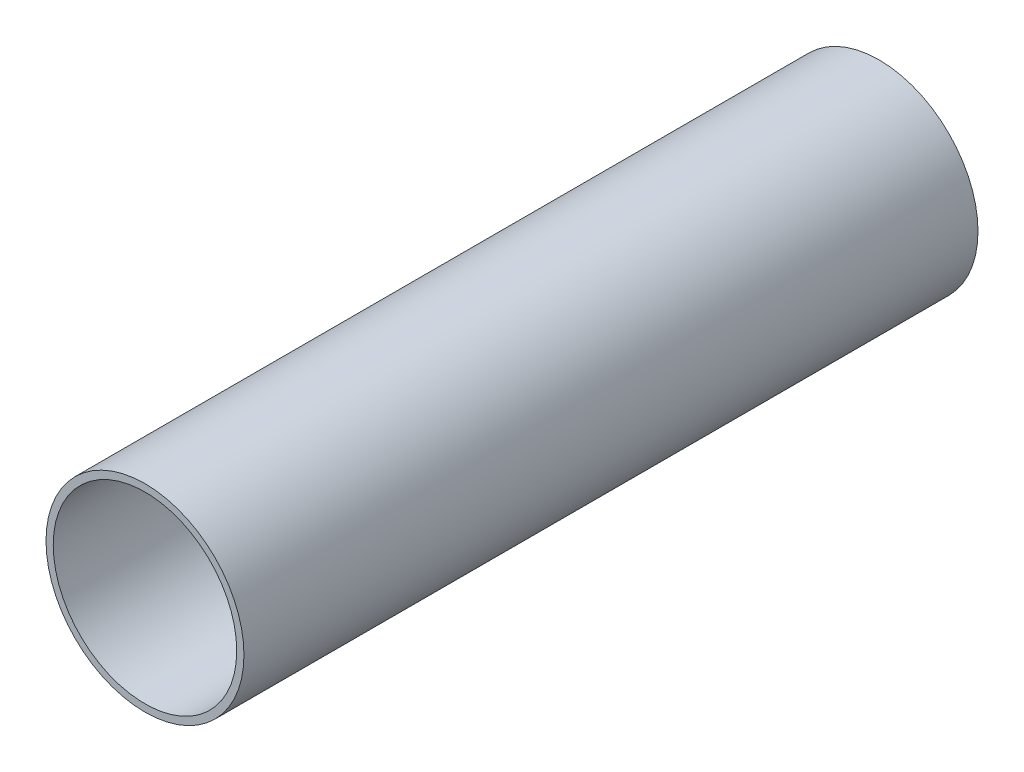
ISO-10303-21;
HEADER;
FILE_DESCRIPTION(('STEP AP214'),'2;1');
FILE_NAME('part.step','',(''),(''),'','','');
FILE_SCHEMA(('AUTOMOTIVE_DESIGN { 1 0 10303 214 1 1 1 1 }'));
ENDSEC;
DATA;
#1=APPLICATION_CONTEXT('core data for automotive mechanical design processes');
#2=APPLICATION_PROTOCOL_DEFINITION('international standard','automotive_design',2000,#1);
#3=PRODUCT_CONTEXT('',#1,'mechanical');
#4=PRODUCT('Part','Part','',(#3));
#5=PRODUCT_RELATED_PRODUCT_CATEGORY('part','',(#4));
#6=PRODUCT_DEFINITION_FORMATION('','',#4);
#7=PRODUCT_DEFINITION_CONTEXT('part definition',#1,'design');
#8=PRODUCT_DEFINITION('design','',#6,#7);
#9=PRODUCT_DEFINITION_SHAPE('','',#8);
#10=(LENGTH_UNIT() NAMED_UNIT(*) SI_UNIT(.MILLI.,.METRE.));
#11=(NAMED_UNIT(*) PLANE_ANGLE_UNIT() SI_UNIT($,.RADIAN.));
#12=(NAMED_UNIT(*) SI_UNIT($,.STERADIAN.) SOLID_ANGLE_UNIT());
#13=UNCERTAINTY_MEASURE_WITH_UNIT(LENGTH_MEASURE(1.E-05),#10,'distance_accuracy_value','');
#14=(GEOMETRIC_REPRESENTATION_CONTEXT(3) GLOBAL_UNCERTAINTY_ASSIGNED_CONTEXT((#13)) GLOBAL_UNIT_ASSIGNED_CONTEXT((#10,
#11,#12)) REPRESENTATION_CONTEXT('',''));
#15=CARTESIAN_POINT('',(0.,0.,0.));
#16=DIRECTION('',(0.,0.,1.));
#17=DIRECTION('',(1.,0.,0.));
#18=AXIS2_PLACEMENT_3D('',#15,#16,#17);
#19=CARTESIAN_POINT('',(0.,0.,203.2));
#20=DIRECTION('',(0.,0.,1.));
#21=DIRECTION('',(1.,0.,0.));
#22=AXIS2_PLACEMENT_3D('',#19,#20,#21);
#23=PLANE('',#22);
#24=CARTESIAN_POINT('',(0.,0.,203.2));
#25=DIRECTION('',(0.,0.,1.));
#26=DIRECTION('',(1.,0.,0.));
#27=AXIS2_PLACEMENT_3D('',#24,#25,#26);
#28=CIRCLE('',#27,54.8);
#29=CARTESIAN_POINT('',(54.8,0.,203.2));
#30=VERTEX_POINT('',#29);
#31=EDGE_CURVE('E10',#30,#30,#28,.T.);
#32=ORIENTED_EDGE('',*,*,#31,.T.);
#33=EDGE_LOOP('',(#32));
#34=FACE_BOUND('',#33,.T.);
#35=CARTESIAN_POINT('',(0.,0.,203.2));
#36=DIRECTION('',(0.,0.,1.));
#37=DIRECTION('',(1.,0.,0.));
#38=AXIS2_PLACEMENT_3D('',#35,#36,#37);
#39=CIRCLE('',#38,50.8);
#40=CARTESIAN_POINT('',(50.8,0.,203.2));
#41=VERTEX_POINT('',#40);
#42=EDGE_CURVE('E50',#41,#41,#39,.T.);
#43=ORIENTED_EDGE('',*,*,#42,.F.);
#44=EDGE_LOOP('',(#43));
#45=FACE_BOUND('',#44,.T.);
#46=ADVANCED_FACE('F37',(#34,#45),#23,.T.);
#47=CARTESIAN_POINT('',(0.,0.,-203.2));
#48=DIRECTION('',(0.,0.,1.));
#49=DIRECTION('',(1.,0.,0.));
#50=AXIS2_PLACEMENT_3D('',#47,#48,#49);
#51=PLANE('',#50);
#52=CARTESIAN_POINT('',(0.,0.,-203.2));
#53=DIRECTION('',(0.,0.,1.));
#54=DIRECTION('',(1.,0.,0.));
#55=AXIS2_PLACEMENT_3D('',#52,#53,#54);
#56=CIRCLE('',#55,54.8);
#57=CARTESIAN_POINT('',(54.8,0.,-203.2));
#58=VERTEX_POINT('',#57);
#59=EDGE_CURVE('E41',#58,#58,#56,.T.);
#60=ORIENTED_EDGE('',*,*,#59,.F.);
#61=EDGE_LOOP('',(#60));
#62=FACE_BOUND('',#61,.T.);
#63=CARTESIAN_POINT('',(0.,0.,-203.2));
#64=DIRECTION('',(0.,0.,1.));
#65=DIRECTION('',(1.,0.,0.));
#66=AXIS2_PLACEMENT_3D('',#63,#64,#65);
#67=CIRCLE('',#66,50.8);
#68=CARTESIAN_POINT('',(50.8,0.,-203.2));
#69=VERTEX_POINT('',#68);
#70=EDGE_CURVE('E52',#69,#69,#67,.T.);
#71=ORIENTED_EDGE('',*,*,#70,.T.);
#72=EDGE_LOOP('',(#71));
#73=FACE_BOUND('',#72,.T.);
#74=ADVANCED_FACE('F64',(#62,#73),#51,.F.);
#75=CARTESIAN_POINT('',(0.,0.,203.2));
#76=DIRECTION('',(0.,0.,-1.));
#77=DIRECTION('',(-1.,0.,0.));
#78=AXIS2_PLACEMENT_3D('',#75,#76,#77);
#79=CYLINDRICAL_SURFACE('',#78,54.8);
#80=ORIENTED_EDGE('',*,*,#31,.F.);
#81=EDGE_LOOP('',(#80));
#82=FACE_BOUND('',#81,.T.);
#83=ORIENTED_EDGE('',*,*,#59,.T.);
#84=EDGE_LOOP('',(#83));
#85=FACE_BOUND('',#84,.T.);
#86=ADVANCED_FACE('F39',(#82,#85),#79,.T.);
#87=CARTESIAN_POINT('',(0.,0.,203.2));
#88=DIRECTION('',(0.,0.,-1.));
#89=DIRECTION('',(-1.,0.,0.));
#90=AXIS2_PLACEMENT_3D('',#87,#88,#89);
#91=CYLINDRICAL_SURFACE('',#90,50.8);
#92=ORIENTED_EDGE('',*,*,#42,.T.);
#93=EDGE_LOOP('',(#92));
#94=FACE_BOUND('',#93,.T.);
#95=ORIENTED_EDGE('',*,*,#70,.F.);
#96=EDGE_LOOP('',(#95));
#97=FACE_BOUND('',#96,.T.);
#98=ADVANCED_FACE('F60',(#94,#97),#91,.F.);
#99=CLOSED_SHELL('',(#46,#74,#86,#98));
#100=MANIFOLD_SOLID_BREP('B2',#99);
#101=ADVANCED_BREP_SHAPE_REPRESENTATION('',(#18,#100),#14);
#102=SHAPE_DEFINITION_REPRESENTATION(#9,#101);
ENDSEC;
END-ISO-10303-21;
